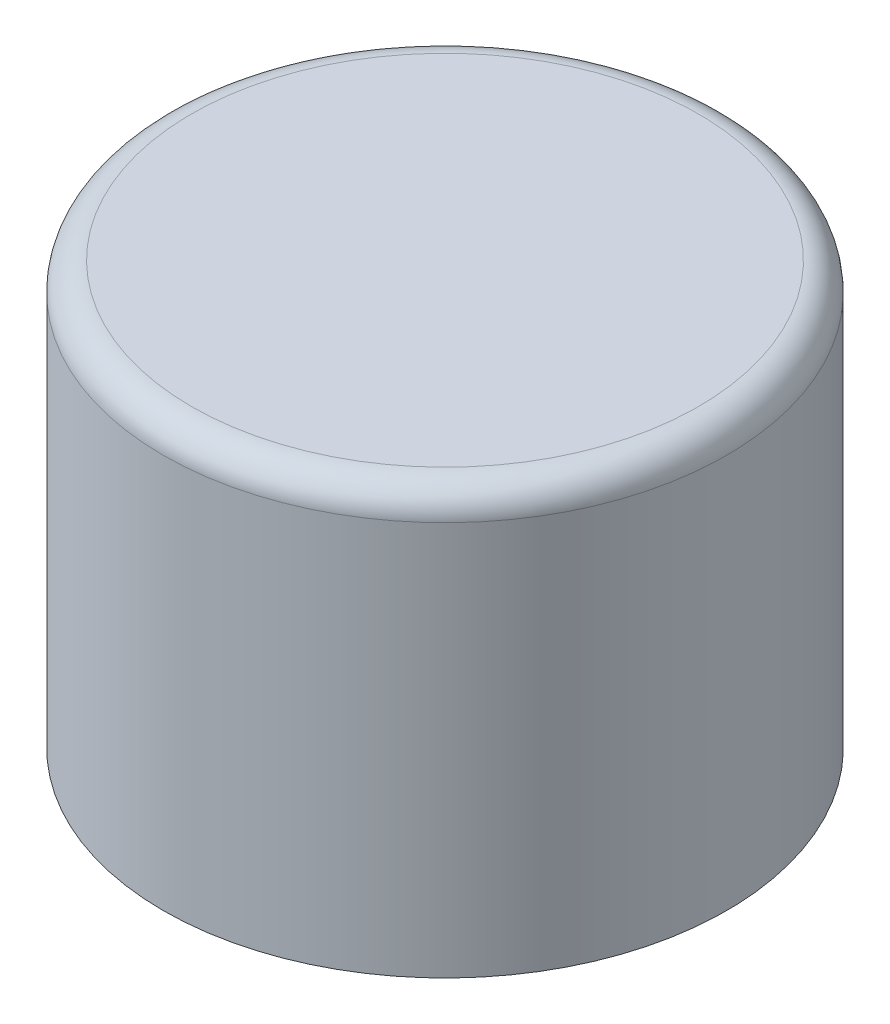
ISO-10303-21;
HEADER;
FILE_DESCRIPTION(('STEP AP214'),'2;1');
FILE_NAME('part.step','',(''),(''),'','','');
FILE_SCHEMA(('AUTOMOTIVE_DESIGN { 1 0 10303 214 1 1 1 1 }'));
ENDSEC;
DATA;
#1=APPLICATION_CONTEXT('core data for automotive mechanical design processes');
#2=APPLICATION_PROTOCOL_DEFINITION('international standard','automotive_design',2000,#1);
#3=PRODUCT_CONTEXT('',#1,'mechanical');
#4=PRODUCT('Part','Part','',(#3));
#5=PRODUCT_RELATED_PRODUCT_CATEGORY('part','',(#4));
#6=PRODUCT_DEFINITION_FORMATION('','',#4);
#7=PRODUCT_DEFINITION_CONTEXT('part definition',#1,'design');
#8=PRODUCT_DEFINITION('design','',#6,#7);
#9=PRODUCT_DEFINITION_SHAPE('','',#8);
#10=(LENGTH_UNIT() NAMED_UNIT(*) SI_UNIT(.MILLI.,.METRE.));
#11=(NAMED_UNIT(*) PLANE_ANGLE_UNIT() SI_UNIT($,.RADIAN.));
#12=(NAMED_UNIT(*) SI_UNIT($,.STERADIAN.) SOLID_ANGLE_UNIT());
#13=UNCERTAINTY_MEASURE_WITH_UNIT(LENGTH_MEASURE(1.E-05),#10,'distance_accuracy_value','');
#14=(GEOMETRIC_REPRESENTATION_CONTEXT(3) GLOBAL_UNCERTAINTY_ASSIGNED_CONTEXT((#13)) GLOBAL_UNIT_ASSIGNED_CONTEXT((#10,
#11,#12)) REPRESENTATION_CONTEXT('',''));
#15=CARTESIAN_POINT('',(0.,0.,0.));
#16=DIRECTION('',(0.,0.,1.));
#17=DIRECTION('',(1.,0.,0.));
#18=AXIS2_PLACEMENT_3D('',#15,#16,#17);
#19=CARTESIAN_POINT('',(0.,0.,0.));
#20=DIRECTION('',(0.,-1.,0.));
#21=DIRECTION('',(0.,0.,-1.));
#22=AXIS2_PLACEMENT_3D('',#19,#20,#21);
#23=CYLINDRICAL_SURFACE('',#22,4.);
#24=CARTESIAN_POINT('',(0.,12.5,0.));
#25=DIRECTION('',(0.,-1.,0.));
#26=DIRECTION('',(0.,0.,-1.));
#27=AXIS2_PLACEMENT_3D('',#24,#25,#26);
#28=CIRCLE('',#27,4.);
#29=CARTESIAN_POINT('',(0.,12.5,-4.));
#30=VERTEX_POINT('',#29);
#31=EDGE_CURVE('E77',#30,#30,#28,.T.);
#32=ORIENTED_EDGE('',*,*,#31,.T.);
#33=EDGE_LOOP('',(#32));
#34=FACE_BOUND('',#33,.T.);
#35=CARTESIAN_POINT('',(0.,8.5,0.));
#36=DIRECTION('',(0.,-1.,0.));
#37=DIRECTION('',(0.,0.,-1.));
#38=AXIS2_PLACEMENT_3D('',#35,#36,#37);
#39=CIRCLE('',#38,4.);
#40=CARTESIAN_POINT('',(0.,8.5,-4.));
#41=VERTEX_POINT('',#40);
#42=EDGE_CURVE('E50',#41,#41,#39,.T.);
#43=ORIENTED_EDGE('',*,*,#42,.F.);
#44=EDGE_LOOP('',(#43));
#45=FACE_BOUND('',#44,.T.);
#46=ADVANCED_FACE('F37',(#34,#45),#23,.T.);
#47=CARTESIAN_POINT('',(0.,8.5,-4.));
#48=DIRECTION('',(0.,-1.,0.));
#49=DIRECTION('',(0.,0.,-1.));
#50=AXIS2_PLACEMENT_3D('',#47,#48,#49);
#51=PLANE('',#50);
#52=ORIENTED_EDGE('',*,*,#42,.T.);
#53=EDGE_LOOP('',(#52));
#54=FACE_BOUND('',#53,.T.);
#55=CARTESIAN_POINT('',(0.,8.5,0.));
#56=DIRECTION('',(0.,-1.,0.));
#57=DIRECTION('',(0.,0.,-1.));
#58=AXIS2_PLACEMENT_3D('',#55,#56,#57);
#59=CIRCLE('',#58,2.5);
#60=CARTESIAN_POINT('',(0.,8.5,-2.5));
#61=VERTEX_POINT('',#60);
#62=EDGE_CURVE('E55',#61,#61,#59,.T.);
#63=ORIENTED_EDGE('',*,*,#62,.F.);
#64=EDGE_LOOP('',(#63));
#65=FACE_BOUND('',#64,.T.);
#66=ADVANCED_FACE('F98',(#54,#65),#51,.T.);
#67=CARTESIAN_POINT('',(0.,0.,0.));
#68=DIRECTION('',(0.,-1.,0.));
#69=DIRECTION('',(0.,0.,-1.));
#70=AXIS2_PLACEMENT_3D('',#67,#68,#69);
#71=CYLINDRICAL_SURFACE('',#70,2.5);
#72=ORIENTED_EDGE('',*,*,#62,.T.);
#73=EDGE_LOOP('',(#72));
#74=FACE_BOUND('',#73,.T.);
#75=CARTESIAN_POINT('',(0.,12.5,0.));
#76=DIRECTION('',(0.,-1.,0.));
#77=DIRECTION('',(0.,0.,-1.));
#78=AXIS2_PLACEMENT_3D('',#75,#76,#77);
#79=CIRCLE('',#78,2.5);
#80=CARTESIAN_POINT('',(0.,12.5,-2.5));
#81=VERTEX_POINT('',#80);
#82=EDGE_CURVE('E61',#81,#81,#79,.T.);
#83=ORIENTED_EDGE('',*,*,#82,.F.);
#84=EDGE_LOOP('',(#83));
#85=FACE_BOUND('',#84,.T.);
#86=ADVANCED_FACE('F102',(#74,#85),#71,.F.);
#87=CARTESIAN_POINT('',(0.,12.5,-2.5));
#88=DIRECTION('',(0.,-1.,0.));
#89=DIRECTION('',(0.,0.,-1.));
#90=AXIS2_PLACEMENT_3D('',#87,#88,#89);
#91=PLANE('',#90);
#92=ORIENTED_EDGE('',*,*,#82,.T.);
#93=EDGE_LOOP('',(#92));
#94=FACE_BOUND('',#93,.T.);
#95=ADVANCED_FACE('F108',(#94),#91,.T.);
#96=CARTESIAN_POINT('',(0.,15.,0.));
#97=DIRECTION('',(0.,1.,0.));
#98=DIRECTION('',(0.,0.,1.));
#99=AXIS2_PLACEMENT_3D('',#96,#97,#98);
#100=PLANE('',#99);
#101=CARTESIAN_POINT('',(0.,15.,0.));
#102=DIRECTION('',(0.,1.,0.));
#103=DIRECTION('',(0.,0.,1.));
#104=AXIS2_PLACEMENT_3D('',#101,#102,#103);
#105=CIRCLE('',#104,9.);
#106=CARTESIAN_POINT('',(0.,15.,9.));
#107=VERTEX_POINT('',#106);
#108=EDGE_CURVE('E10',#107,#107,#105,.T.);
#109=ORIENTED_EDGE('',*,*,#108,.T.);
#110=EDGE_LOOP('',(#109));
#111=FACE_BOUND('',#110,.T.);
#112=ADVANCED_FACE('F112',(#111),#100,.T.);
#113=CARTESIAN_POINT('',(0.,0.,0.));
#114=DIRECTION('',(0.,-1.,0.));
#115=DIRECTION('',(0.,0.,-1.));
#116=AXIS2_PLACEMENT_3D('',#113,#114,#115);
#117=CYLINDRICAL_SURFACE('',#116,10.);
#118=CARTESIAN_POINT('',(0.,14.,0.));
#119=DIRECTION('',(0.,1.,0.));
#120=DIRECTION('',(0.,0.,1.));
#121=AXIS2_PLACEMENT_3D('',#118,#119,#120);
#122=CIRCLE('',#121,10.);
#123=CARTESIAN_POINT('',(0.,14.,10.));
#124=VERTEX_POINT('',#123);
#125=EDGE_CURVE('E45',#124,#124,#122,.F.);
#126=ORIENTED_EDGE('',*,*,#125,.T.);
#127=EDGE_LOOP('',(#126));
#128=FACE_BOUND('',#127,.T.);
#129=CARTESIAN_POINT('',(0.,0.,0.));
#130=DIRECTION('',(0.,-1.,0.));
#131=DIRECTION('',(0.,0.,-1.));
#132=AXIS2_PLACEMENT_3D('',#129,#130,#131);
#133=CIRCLE('',#132,10.);
#134=CARTESIAN_POINT('',(0.,0.,-10.));
#135=VERTEX_POINT('',#134);
#136=EDGE_CURVE('E65',#135,#135,#133,.T.);
#137=ORIENTED_EDGE('',*,*,#136,.F.);
#138=EDGE_LOOP('',(#137));
#139=FACE_BOUND('',#138,.T.);
#140=ADVANCED_FACE('F116',(#128,#139),#117,.T.);
#141=CARTESIAN_POINT('',(0.,0.,-10.));
#142=DIRECTION('',(0.,-1.,0.));
#143=DIRECTION('',(0.,0.,-1.));
#144=AXIS2_PLACEMENT_3D('',#141,#142,#143);
#145=PLANE('',#144);
#146=ORIENTED_EDGE('',*,*,#136,.T.);
#147=EDGE_LOOP('',(#146));
#148=FACE_BOUND('',#147,.T.);
#149=CARTESIAN_POINT('',(0.,0.,0.));
#150=DIRECTION('',(0.,-1.,0.));
#151=DIRECTION('',(0.,0.,-1.));
#152=AXIS2_PLACEMENT_3D('',#149,#150,#151);
#153=CIRCLE('',#152,9.);
#154=CARTESIAN_POINT('',(0.,0.,-9.));
#155=VERTEX_POINT('',#154);
#156=EDGE_CURVE('E69',#155,#155,#153,.T.);
#157=ORIENTED_EDGE('',*,*,#156,.F.);
#158=EDGE_LOOP('',(#157));
#159=FACE_BOUND('',#158,.T.);
#160=ADVANCED_FACE('F94',(#148,#159),#145,.T.);
#161=CARTESIAN_POINT('',(0.,0.,0.));
#162=DIRECTION('',(0.,-1.,0.));
#163=DIRECTION('',(0.,0.,-1.));
#164=AXIS2_PLACEMENT_3D('',#161,#162,#163);
#165=CYLINDRICAL_SURFACE('',#164,9.);
#166=ORIENTED_EDGE('',*,*,#156,.T.);
#167=EDGE_LOOP('',(#166));
#168=FACE_BOUND('',#167,.T.);
#169=CARTESIAN_POINT('',(0.,12.5,0.));
#170=DIRECTION('',(0.,-1.,0.));
#171=DIRECTION('',(0.,0.,-1.));
#172=AXIS2_PLACEMENT_3D('',#169,#170,#171);
#173=CIRCLE('',#172,9.);
#174=CARTESIAN_POINT('',(0.,12.5,-9.));
#175=VERTEX_POINT('',#174);
#176=EDGE_CURVE('E73',#175,#175,#173,.T.);
#177=ORIENTED_EDGE('',*,*,#176,.F.);
#178=EDGE_LOOP('',(#177));
#179=FACE_BOUND('',#178,.T.);
#180=ADVANCED_FACE('F86',(#168,#179),#165,.F.);
#181=CARTESIAN_POINT('',(0.,12.5,-9.));
#182=DIRECTION('',(0.,-1.,0.));
#183=DIRECTION('',(0.,0.,-1.));
#184=AXIS2_PLACEMENT_3D('',#181,#182,#183);
#185=PLANE('',#184);
#186=ORIENTED_EDGE('',*,*,#176,.T.);
#187=EDGE_LOOP('',(#186));
#188=FACE_BOUND('',#187,.T.);
#189=ORIENTED_EDGE('',*,*,#31,.F.);
#190=EDGE_LOOP('',(#189));
#191=FACE_BOUND('',#190,.T.);
#192=ADVANCED_FACE('F84',(#188,#191),#185,.T.);
#193=CARTESIAN_POINT('',(0.,14.,0.));
#194=DIRECTION('',(0.,1.,0.));
#195=DIRECTION('',(0.,0.,1.));
#196=AXIS2_PLACEMENT_3D('',#193,#194,#195);
#197=TOROIDAL_SURFACE('',#196,9.,1.);
#198=ORIENTED_EDGE('',*,*,#108,.F.);
#199=EDGE_LOOP('',(#198));
#200=FACE_BOUND('',#199,.T.);
#201=ORIENTED_EDGE('',*,*,#125,.F.);
#202=EDGE_LOOP('',(#201));
#203=FACE_BOUND('',#202,.T.);
#204=ADVANCED_FACE('F39',(#200,#203),#197,.T.);
#205=CLOSED_SHELL('',(#46,#66,#86,#95,#112,#140,#160,#180,#192,#204));
#206=MANIFOLD_SOLID_BREP('B2',#205);
#207=ADVANCED_BREP_SHAPE_REPRESENTATION('',(#18,#206),#14);
#208=SHAPE_DEFINITION_REPRESENTATION(#9,#207);
ENDSEC;
END-ISO-10303-21;
